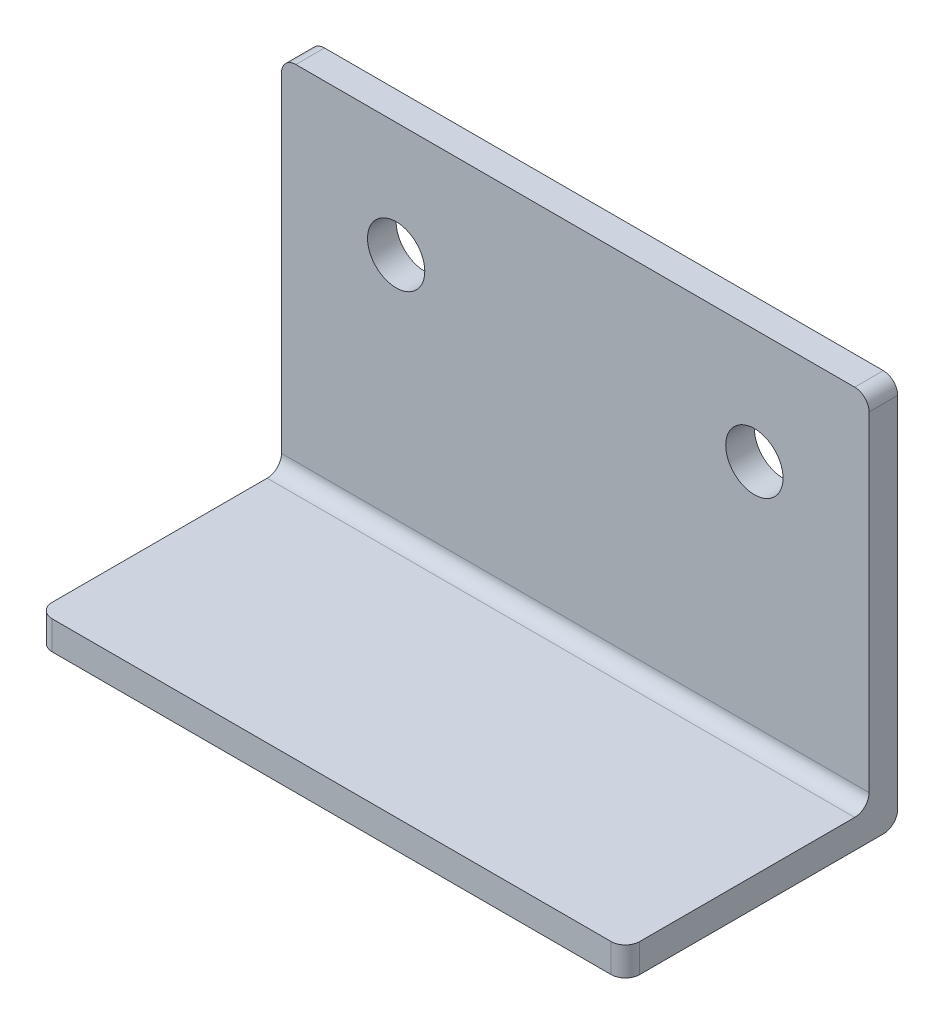
ISO-10303-21;
HEADER;
FILE_DESCRIPTION(('STEP AP214'),'2;1');
FILE_NAME('part.step','',(''),(''),'','','');
FILE_SCHEMA(('AUTOMOTIVE_DESIGN { 1 0 10303 214 1 1 1 1 }'));
ENDSEC;
DATA;
#1=APPLICATION_CONTEXT('core data for automotive mechanical design processes');
#2=APPLICATION_PROTOCOL_DEFINITION('international standard','automotive_design',2000,#1);
#3=PRODUCT_CONTEXT('',#1,'mechanical');
#4=PRODUCT('Part','Part','',(#3));
#5=PRODUCT_RELATED_PRODUCT_CATEGORY('part','',(#4));
#6=PRODUCT_DEFINITION_FORMATION('','',#4);
#7=PRODUCT_DEFINITION_CONTEXT('part definition',#1,'design');
#8=PRODUCT_DEFINITION('design','',#6,#7);
#9=PRODUCT_DEFINITION_SHAPE('','',#8);
#10=(LENGTH_UNIT() NAMED_UNIT(*) SI_UNIT(.MILLI.,.METRE.));
#11=(NAMED_UNIT(*) PLANE_ANGLE_UNIT() SI_UNIT($,.RADIAN.));
#12=(NAMED_UNIT(*) SI_UNIT($,.STERADIAN.) SOLID_ANGLE_UNIT());
#13=UNCERTAINTY_MEASURE_WITH_UNIT(LENGTH_MEASURE(1.E-05),#10,'distance_accuracy_value','');
#14=(GEOMETRIC_REPRESENTATION_CONTEXT(3) GLOBAL_UNCERTAINTY_ASSIGNED_CONTEXT((#13)) GLOBAL_UNIT_ASSIGNED_CONTEXT((#10,
#11,#12)) REPRESENTATION_CONTEXT('',''));
#15=CARTESIAN_POINT('',(0.,0.,0.));
#16=DIRECTION('',(0.,0.,1.));
#17=DIRECTION('',(1.,0.,0.));
#18=AXIS2_PLACEMENT_3D('',#15,#16,#17);
#19=CARTESIAN_POINT('',(20.5,2.,-9.5));
#20=DIRECTION('',(-1.,0.,0.));
#21=DIRECTION('',(0.,0.,1.));
#22=AXIS2_PLACEMENT_3D('',#19,#20,#21);
#23=PLANE('',#22);
#24=DIRECTION('',(0.,-1.,0.));
#25=VECTOR('',#24,1.);
#26=CARTESIAN_POINT('',(20.5,2.,-9.5));
#27=LINE('',#26,#25);
#28=CARTESIAN_POINT('',(20.5,26.,-9.5));
#29=VERTEX_POINT('',#28);
#30=CARTESIAN_POINT('',(20.5,1.,-9.5));
#31=VERTEX_POINT('',#30);
#32=EDGE_CURVE('E146',#29,#31,#27,.T.);
#33=ORIENTED_EDGE('',*,*,#32,.F.);
#34=DIRECTION('',(0.,0.,-1.));
#35=VECTOR('',#34,1.);
#36=CARTESIAN_POINT('',(20.5,26.,-7.5));
#37=LINE('',#36,#35);
#38=CARTESIAN_POINT('',(20.5,26.,-7.5));
#39=VERTEX_POINT('',#38);
#40=EDGE_CURVE('E47',#29,#39,#37,.F.);
#41=ORIENTED_EDGE('',*,*,#40,.T.);
#42=DIRECTION('',(0.,-1.,0.));
#43=VECTOR('',#42,1.);
#44=CARTESIAN_POINT('',(20.5,27.,-7.5));
#45=LINE('',#44,#43);
#46=CARTESIAN_POINT('',(20.5,3.,-7.5));
#47=VERTEX_POINT('',#46);
#48=EDGE_CURVE('E124',#39,#47,#45,.T.);
#49=ORIENTED_EDGE('',*,*,#48,.T.);
#50=CARTESIAN_POINT('',(20.5,3.,-6.5));
#51=DIRECTION('',(-1.,0.,0.));
#52=DIRECTION('',(0.,0.,1.));
#53=AXIS2_PLACEMENT_3D('',#50,#51,#52);
#54=CIRCLE('',#53,1.);
#55=CARTESIAN_POINT('',(20.5,2.,-6.5));
#56=VERTEX_POINT('',#55);
#57=EDGE_CURVE('E127',#47,#56,#54,.T.);
#58=ORIENTED_EDGE('',*,*,#57,.T.);
#59=DIRECTION('',(0.,0.,-1.));
#60=VECTOR('',#59,1.);
#61=CARTESIAN_POINT('',(20.5,2.,-9.5));
#62=LINE('',#61,#60);
#63=CARTESIAN_POINT('',(20.5,2.,8.5));
#64=VERTEX_POINT('',#63);
#65=EDGE_CURVE('E214',#64,#56,#62,.T.);
#66=ORIENTED_EDGE('',*,*,#65,.F.);
#67=DIRECTION('',(0.,-1.,0.));
#68=VECTOR('',#67,1.);
#69=CARTESIAN_POINT('',(20.5,2.,8.5));
#70=LINE('',#69,#68);
#71=CARTESIAN_POINT('',(20.5,0.,8.5));
#72=VERTEX_POINT('',#71);
#73=EDGE_CURVE('E174',#64,#72,#70,.T.);
#74=ORIENTED_EDGE('',*,*,#73,.T.);
#75=DIRECTION('',(0.,0.,-1.));
#76=VECTOR('',#75,1.);
#77=CARTESIAN_POINT('',(20.5,0.,-9.5));
#78=LINE('',#77,#76);
#79=CARTESIAN_POINT('',(20.5,0.,-8.5));
#80=VERTEX_POINT('',#79);
#81=EDGE_CURVE('E213',#72,#80,#78,.T.);
#82=ORIENTED_EDGE('',*,*,#81,.T.);
#83=CARTESIAN_POINT('',(20.5,1.,-8.5));
#84=DIRECTION('',(-1.,0.,0.));
#85=DIRECTION('',(0.,0.,1.));
#86=AXIS2_PLACEMENT_3D('',#83,#84,#85);
#87=CIRCLE('',#86,1.);
#88=EDGE_CURVE('E162',#80,#31,#87,.F.);
#89=ORIENTED_EDGE('',*,*,#88,.T.);
#90=EDGE_LOOP('',(#33,#41,#49,#58,#66,#74,#82,#89));
#91=FACE_BOUND('',#90,.T.);
#92=ADVANCED_FACE('F39',(#91),#23,.F.);
#93=CARTESIAN_POINT('',(-20.5,2.,-9.5));
#94=DIRECTION('',(0.,0.,1.));
#95=DIRECTION('',(1.,0.,0.));
#96=AXIS2_PLACEMENT_3D('',#93,#94,#95);
#97=PLANE('',#96);
#98=CARTESIAN_POINT('',(-12.5,19.,-9.5));
#99=DIRECTION('',(0.,0.,1.));
#100=DIRECTION('',(1.,0.,0.));
#101=AXIS2_PLACEMENT_3D('',#98,#99,#100);
#102=CIRCLE('',#101,2.);
#103=CARTESIAN_POINT('',(-10.5,19.,-9.5));
#104=VERTEX_POINT('',#103);
#105=EDGE_CURVE('E208',#104,#104,#102,.T.);
#106=ORIENTED_EDGE('',*,*,#105,.T.);
#107=EDGE_LOOP('',(#106));
#108=FACE_BOUND('',#107,.T.);
#109=CARTESIAN_POINT('',(12.5,19.,-9.5));
#110=DIRECTION('',(0.,0.,1.));
#111=DIRECTION('',(1.,0.,0.));
#112=AXIS2_PLACEMENT_3D('',#109,#110,#111);
#113=CIRCLE('',#112,2.);
#114=CARTESIAN_POINT('',(14.5,19.,-9.5));
#115=VERTEX_POINT('',#114);
#116=EDGE_CURVE('E374',#115,#115,#113,.T.);
#117=ORIENTED_EDGE('',*,*,#116,.T.);
#118=EDGE_LOOP('',(#117));
#119=FACE_BOUND('',#118,.T.);
#120=DIRECTION('',(-1.,0.,0.));
#121=VECTOR('',#120,1.);
#122=CARTESIAN_POINT('',(-20.5,27.,-9.5));
#123=LINE('',#122,#121);
#124=CARTESIAN_POINT('',(19.5,27.,-9.5));
#125=VERTEX_POINT('',#124);
#126=CARTESIAN_POINT('',(-19.5,27.,-9.5));
#127=VERTEX_POINT('',#126);
#128=EDGE_CURVE('E133',#125,#127,#123,.T.);
#129=ORIENTED_EDGE('',*,*,#128,.F.);
#130=CARTESIAN_POINT('',(19.5,26.,-9.5));
#131=DIRECTION('',(0.,0.,1.));
#132=DIRECTION('',(1.,0.,0.));
#133=AXIS2_PLACEMENT_3D('',#130,#131,#132);
#134=CIRCLE('',#133,1.);
#135=EDGE_CURVE('E61',#125,#29,#134,.F.);
#136=ORIENTED_EDGE('',*,*,#135,.T.);
#137=ORIENTED_EDGE('',*,*,#32,.T.);
#138=DIRECTION('',(-1.,0.,0.));
#139=VECTOR('',#138,1.);
#140=CARTESIAN_POINT('',(-20.5,1.,-9.5));
#141=LINE('',#140,#139);
#142=CARTESIAN_POINT('',(-20.5,1.,-9.5));
#143=VERTEX_POINT('',#142);
#144=EDGE_CURVE('E154',#31,#143,#141,.T.);
#145=ORIENTED_EDGE('',*,*,#144,.T.);
#146=DIRECTION('',(0.,-1.,0.));
#147=VECTOR('',#146,1.);
#148=CARTESIAN_POINT('',(-20.5,2.,-9.5));
#149=LINE('',#148,#147);
#150=CARTESIAN_POINT('',(-20.5,26.,-9.5));
#151=VERTEX_POINT('',#150);
#152=EDGE_CURVE('E149',#151,#143,#149,.T.);
#153=ORIENTED_EDGE('',*,*,#152,.F.);
#154=CARTESIAN_POINT('',(-19.5,26.,-9.5));
#155=DIRECTION('',(0.,0.,1.));
#156=DIRECTION('',(1.,0.,0.));
#157=AXIS2_PLACEMENT_3D('',#154,#155,#156);
#158=CIRCLE('',#157,1.);
#159=EDGE_CURVE('E190',#151,#127,#158,.F.);
#160=ORIENTED_EDGE('',*,*,#159,.T.);
#161=EDGE_LOOP('',(#129,#136,#137,#145,#153,#160));
#162=FACE_BOUND('',#161,.T.);
#163=ADVANCED_FACE('F203',(#108,#119,#162),#97,.F.);
#164=CARTESIAN_POINT('',(-20.5,2.,-9.5));
#165=DIRECTION('',(1.,0.,0.));
#166=DIRECTION('',(0.,0.,-1.));
#167=AXIS2_PLACEMENT_3D('',#164,#165,#166);
#168=PLANE('',#167);
#169=DIRECTION('',(0.,-1.,0.));
#170=VECTOR('',#169,1.);
#171=CARTESIAN_POINT('',(-20.5,27.,-7.5));
#172=LINE('',#171,#170);
#173=CARTESIAN_POINT('',(-20.5,26.,-7.5));
#174=VERTEX_POINT('',#173);
#175=CARTESIAN_POINT('',(-20.5,3.,-7.5));
#176=VERTEX_POINT('',#175);
#177=EDGE_CURVE('E132',#174,#176,#172,.T.);
#178=ORIENTED_EDGE('',*,*,#177,.F.);
#179=DIRECTION('',(0.,0.,1.));
#180=VECTOR('',#179,1.);
#181=CARTESIAN_POINT('',(-20.5,26.,-9.5));
#182=LINE('',#181,#180);
#183=EDGE_CURVE('E188',#174,#151,#182,.F.);
#184=ORIENTED_EDGE('',*,*,#183,.T.);
#185=ORIENTED_EDGE('',*,*,#152,.T.);
#186=CARTESIAN_POINT('',(-20.5,1.,-8.5));
#187=DIRECTION('',(1.,0.,0.));
#188=DIRECTION('',(0.,0.,-1.));
#189=AXIS2_PLACEMENT_3D('',#186,#187,#188);
#190=CIRCLE('',#189,1.);
#191=CARTESIAN_POINT('',(-20.5,0.,-8.5));
#192=VERTEX_POINT('',#191);
#193=EDGE_CURVE('E157',#143,#192,#190,.F.);
#194=ORIENTED_EDGE('',*,*,#193,.T.);
#195=DIRECTION('',(0.,0.,1.));
#196=VECTOR('',#195,1.);
#197=CARTESIAN_POINT('',(-20.5,0.,-9.5));
#198=LINE('',#197,#196);
#199=CARTESIAN_POINT('',(-20.5,0.,8.5));
#200=VERTEX_POINT('',#199);
#201=EDGE_CURVE('E224',#192,#200,#198,.T.);
#202=ORIENTED_EDGE('',*,*,#201,.T.);
#203=DIRECTION('',(0.,-1.,0.));
#204=VECTOR('',#203,1.);
#205=CARTESIAN_POINT('',(-20.5,2.,8.5));
#206=LINE('',#205,#204);
#207=CARTESIAN_POINT('',(-20.5,2.,8.5));
#208=VERTEX_POINT('',#207);
#209=EDGE_CURVE('E170',#200,#208,#206,.F.);
#210=ORIENTED_EDGE('',*,*,#209,.T.);
#211=DIRECTION('',(0.,0.,1.));
#212=VECTOR('',#211,1.);
#213=CARTESIAN_POINT('',(-20.5,2.,-9.5));
#214=LINE('',#213,#212);
#215=CARTESIAN_POINT('',(-20.5,2.,-6.5));
#216=VERTEX_POINT('',#215);
#217=EDGE_CURVE('E216',#216,#208,#214,.T.);
#218=ORIENTED_EDGE('',*,*,#217,.F.);
#219=CARTESIAN_POINT('',(-20.5,3.,-6.5));
#220=DIRECTION('',(1.,0.,0.));
#221=DIRECTION('',(0.,0.,-1.));
#222=AXIS2_PLACEMENT_3D('',#219,#220,#221);
#223=CIRCLE('',#222,1.);
#224=EDGE_CURVE('E141',#216,#176,#223,.T.);
#225=ORIENTED_EDGE('',*,*,#224,.T.);
#226=EDGE_LOOP('',(#178,#184,#185,#194,#202,#210,#218,#225));
#227=FACE_BOUND('',#226,.T.);
#228=ADVANCED_FACE('F230',(#227),#168,.F.);
#229=CARTESIAN_POINT('',(-20.5,2.,9.5));
#230=DIRECTION('',(0.,0.,-1.));
#231=DIRECTION('',(-1.,0.,0.));
#232=AXIS2_PLACEMENT_3D('',#229,#230,#231);
#233=PLANE('',#232);
#234=DIRECTION('',(1.,0.,0.));
#235=VECTOR('',#234,1.);
#236=CARTESIAN_POINT('',(-20.5,0.,9.5));
#237=LINE('',#236,#235);
#238=CARTESIAN_POINT('',(-19.5,0.,9.5));
#239=VERTEX_POINT('',#238);
#240=CARTESIAN_POINT('',(19.5,0.,9.5));
#241=VERTEX_POINT('',#240);
#242=EDGE_CURVE('E217',#239,#241,#237,.T.);
#243=ORIENTED_EDGE('',*,*,#242,.T.);
#244=DIRECTION('',(0.,-1.,0.));
#245=VECTOR('',#244,1.);
#246=CARTESIAN_POINT('',(19.5,2.,9.5));
#247=LINE('',#246,#245);
#248=CARTESIAN_POINT('',(19.5,2.,9.5));
#249=VERTEX_POINT('',#248);
#250=EDGE_CURVE('E179',#241,#249,#247,.F.);
#251=ORIENTED_EDGE('',*,*,#250,.T.);
#252=DIRECTION('',(1.,0.,0.));
#253=VECTOR('',#252,1.);
#254=CARTESIAN_POINT('',(-20.5,2.,9.5));
#255=LINE('',#254,#253);
#256=CARTESIAN_POINT('',(-19.5,2.,9.5));
#257=VERTEX_POINT('',#256);
#258=EDGE_CURVE('E220',#257,#249,#255,.T.);
#259=ORIENTED_EDGE('',*,*,#258,.F.);
#260=DIRECTION('',(0.,-1.,0.));
#261=VECTOR('',#260,1.);
#262=CARTESIAN_POINT('',(-19.5,2.,9.5));
#263=LINE('',#262,#261);
#264=EDGE_CURVE('E165',#257,#239,#263,.T.);
#265=ORIENTED_EDGE('',*,*,#264,.T.);
#266=EDGE_LOOP('',(#243,#251,#259,#265));
#267=FACE_BOUND('',#266,.T.);
#268=ADVANCED_FACE('F254',(#267),#233,.F.);
#269=CARTESIAN_POINT('',(0.,2.,0.));
#270=DIRECTION('',(0.,1.,0.));
#271=DIRECTION('',(0.,0.,1.));
#272=AXIS2_PLACEMENT_3D('',#269,#270,#271);
#273=PLANE('',#272);
#274=ORIENTED_EDGE('',*,*,#258,.T.);
#275=CARTESIAN_POINT('',(19.5,2.,8.5));
#276=DIRECTION('',(0.,1.,0.));
#277=DIRECTION('',(0.,0.,1.));
#278=AXIS2_PLACEMENT_3D('',#275,#276,#277);
#279=CIRCLE('',#278,1.);
#280=EDGE_CURVE('E181',#249,#64,#279,.T.);
#281=ORIENTED_EDGE('',*,*,#280,.T.);
#282=ORIENTED_EDGE('',*,*,#65,.T.);
#283=DIRECTION('',(1.,0.,0.));
#284=VECTOR('',#283,1.);
#285=CARTESIAN_POINT('',(0.,2.,-6.5));
#286=LINE('',#285,#284);
#287=EDGE_CURVE('E140',#56,#216,#286,.F.);
#288=ORIENTED_EDGE('',*,*,#287,.T.);
#289=ORIENTED_EDGE('',*,*,#217,.T.);
#290=CARTESIAN_POINT('',(-19.5,2.,8.5));
#291=DIRECTION('',(0.,1.,0.));
#292=DIRECTION('',(0.,0.,1.));
#293=AXIS2_PLACEMENT_3D('',#290,#291,#292);
#294=CIRCLE('',#293,1.);
#295=EDGE_CURVE('E172',#208,#257,#294,.T.);
#296=ORIENTED_EDGE('',*,*,#295,.T.);
#297=EDGE_LOOP('',(#274,#281,#282,#288,#289,#296));
#298=FACE_BOUND('',#297,.T.);
#299=ADVANCED_FACE('F251',(#298),#273,.T.);
#300=CARTESIAN_POINT('',(0.,0.,0.));
#301=DIRECTION('',(0.,1.,0.));
#302=DIRECTION('',(0.,0.,1.));
#303=AXIS2_PLACEMENT_3D('',#300,#301,#302);
#304=PLANE('',#303);
#305=ORIENTED_EDGE('',*,*,#81,.F.);
#306=CARTESIAN_POINT('',(19.5,0.,8.5));
#307=DIRECTION('',(0.,1.,0.));
#308=DIRECTION('',(0.,0.,1.));
#309=AXIS2_PLACEMENT_3D('',#306,#307,#308);
#310=CIRCLE('',#309,1.);
#311=EDGE_CURVE('E177',#72,#241,#310,.F.);
#312=ORIENTED_EDGE('',*,*,#311,.T.);
#313=ORIENTED_EDGE('',*,*,#242,.F.);
#314=CARTESIAN_POINT('',(-19.5,0.,8.5));
#315=DIRECTION('',(0.,1.,0.));
#316=DIRECTION('',(0.,0.,1.));
#317=AXIS2_PLACEMENT_3D('',#314,#315,#316);
#318=CIRCLE('',#317,1.);
#319=EDGE_CURVE('E168',#239,#200,#318,.F.);
#320=ORIENTED_EDGE('',*,*,#319,.T.);
#321=ORIENTED_EDGE('',*,*,#201,.F.);
#322=DIRECTION('',(-1.,0.,0.));
#323=VECTOR('',#322,1.);
#324=CARTESIAN_POINT('',(0.,0.,-8.5));
#325=LINE('',#324,#323);
#326=EDGE_CURVE('E159',#192,#80,#325,.F.);
#327=ORIENTED_EDGE('',*,*,#326,.T.);
#328=EDGE_LOOP('',(#305,#312,#313,#320,#321,#327));
#329=FACE_BOUND('',#328,.T.);
#330=ADVANCED_FACE('F241',(#329),#304,.F.);
#331=CARTESIAN_POINT('',(-20.5,27.,-7.5));
#332=DIRECTION('',(0.,0.,-1.));
#333=DIRECTION('',(-1.,0.,0.));
#334=AXIS2_PLACEMENT_3D('',#331,#332,#333);
#335=PLANE('',#334);
#336=CARTESIAN_POINT('',(-12.5,19.,-7.5));
#337=DIRECTION('',(0.,0.,1.));
#338=DIRECTION('',(1.,0.,0.));
#339=AXIS2_PLACEMENT_3D('',#336,#337,#338);
#340=CIRCLE('',#339,2.);
#341=CARTESIAN_POINT('',(-10.5,19.,-7.5));
#342=VERTEX_POINT('',#341);
#343=EDGE_CURVE('E371',#342,#342,#340,.T.);
#344=ORIENTED_EDGE('',*,*,#343,.F.);
#345=EDGE_LOOP('',(#344));
#346=FACE_BOUND('',#345,.T.);
#347=CARTESIAN_POINT('',(12.5,19.,-7.5));
#348=DIRECTION('',(0.,0.,1.));
#349=DIRECTION('',(-1.,0.,0.));
#350=AXIS2_PLACEMENT_3D('',#347,#348,#349);
#351=CIRCLE('',#350,2.);
#352=CARTESIAN_POINT('',(10.5,19.,-7.5));
#353=VERTEX_POINT('',#352);
#354=EDGE_CURVE('E378',#353,#353,#351,.T.);
#355=ORIENTED_EDGE('',*,*,#354,.F.);
#356=EDGE_LOOP('',(#355));
#357=FACE_BOUND('',#356,.T.);
#358=ORIENTED_EDGE('',*,*,#48,.F.);
#359=CARTESIAN_POINT('',(19.5,26.,-7.5));
#360=DIRECTION('',(0.,0.,-1.));
#361=DIRECTION('',(-1.,0.,0.));
#362=AXIS2_PLACEMENT_3D('',#359,#360,#361);
#363=CIRCLE('',#362,1.);
#364=CARTESIAN_POINT('',(19.5,27.,-7.5));
#365=VERTEX_POINT('',#364);
#366=EDGE_CURVE('E11',#39,#365,#363,.F.);
#367=ORIENTED_EDGE('',*,*,#366,.T.);
#368=DIRECTION('',(1.,0.,0.));
#369=VECTOR('',#368,1.);
#370=CARTESIAN_POINT('',(-20.5,27.,-7.5));
#371=LINE('',#370,#369);
#372=CARTESIAN_POINT('',(-19.5,27.,-7.5));
#373=VERTEX_POINT('',#372);
#374=EDGE_CURVE('E201',#373,#365,#371,.T.);
#375=ORIENTED_EDGE('',*,*,#374,.F.);
#376=CARTESIAN_POINT('',(-19.5,26.,-7.5));
#377=DIRECTION('',(0.,0.,-1.));
#378=DIRECTION('',(-1.,0.,0.));
#379=AXIS2_PLACEMENT_3D('',#376,#377,#378);
#380=CIRCLE('',#379,1.);
#381=EDGE_CURVE('E186',#373,#174,#380,.F.);
#382=ORIENTED_EDGE('',*,*,#381,.T.);
#383=ORIENTED_EDGE('',*,*,#177,.T.);
#384=DIRECTION('',(1.,0.,0.));
#385=VECTOR('',#384,1.);
#386=CARTESIAN_POINT('',(-20.5,3.,-7.5));
#387=LINE('',#386,#385);
#388=EDGE_CURVE('E139',#176,#47,#387,.T.);
#389=ORIENTED_EDGE('',*,*,#388,.T.);
#390=EDGE_LOOP('',(#358,#367,#375,#382,#383,#389));
#391=FACE_BOUND('',#390,.T.);
#392=ADVANCED_FACE('F143',(#346,#357,#391),#335,.F.);
#393=CARTESIAN_POINT('',(0.,27.,0.));
#394=DIRECTION('',(0.,1.,0.));
#395=DIRECTION('',(0.,0.,1.));
#396=AXIS2_PLACEMENT_3D('',#393,#394,#395);
#397=PLANE('',#396);
#398=ORIENTED_EDGE('',*,*,#374,.T.);
#399=DIRECTION('',(0.,0.,-1.));
#400=VECTOR('',#399,1.);
#401=CARTESIAN_POINT('',(19.5,27.,-9.5));
#402=LINE('',#401,#400);
#403=EDGE_CURVE('E193',#365,#125,#402,.T.);
#404=ORIENTED_EDGE('',*,*,#403,.T.);
#405=ORIENTED_EDGE('',*,*,#128,.T.);
#406=DIRECTION('',(0.,0.,1.));
#407=VECTOR('',#406,1.);
#408=CARTESIAN_POINT('',(-19.5,27.,-7.5));
#409=LINE('',#408,#407);
#410=EDGE_CURVE('E183',#127,#373,#409,.T.);
#411=ORIENTED_EDGE('',*,*,#410,.T.);
#412=EDGE_LOOP('',(#398,#404,#405,#411));
#413=FACE_BOUND('',#412,.T.);
#414=ADVANCED_FACE('F199',(#413),#397,.T.);
#415=CARTESIAN_POINT('',(12.5,19.,-32.5));
#416=DIRECTION('',(0.,0.,1.));
#417=DIRECTION('',(1.,0.,0.));
#418=AXIS2_PLACEMENT_3D('',#415,#416,#417);
#419=CYLINDRICAL_SURFACE('',#418,2.);
#420=ORIENTED_EDGE('',*,*,#354,.T.);
#421=EDGE_LOOP('',(#420));
#422=FACE_BOUND('',#421,.T.);
#423=ORIENTED_EDGE('',*,*,#116,.F.);
#424=EDGE_LOOP('',(#423));
#425=FACE_BOUND('',#424,.T.);
#426=ADVANCED_FACE('F321',(#422,#425),#419,.F.);
#427=CARTESIAN_POINT('',(-12.5,19.,-32.5));
#428=DIRECTION('',(0.,0.,1.));
#429=DIRECTION('',(1.,0.,0.));
#430=AXIS2_PLACEMENT_3D('',#427,#428,#429);
#431=CYLINDRICAL_SURFACE('',#430,2.);
#432=ORIENTED_EDGE('',*,*,#343,.T.);
#433=EDGE_LOOP('',(#432));
#434=FACE_BOUND('',#433,.T.);
#435=ORIENTED_EDGE('',*,*,#105,.F.);
#436=EDGE_LOOP('',(#435));
#437=FACE_BOUND('',#436,.T.);
#438=ADVANCED_FACE('F276',(#434,#437),#431,.F.);
#439=CARTESIAN_POINT('',(-20.5,3.,-6.5));
#440=DIRECTION('',(1.,0.,0.));
#441=DIRECTION('',(0.,0.,-1.));
#442=AXIS2_PLACEMENT_3D('',#439,#440,#441);
#443=CYLINDRICAL_SURFACE('',#442,1.);
#444=ORIENTED_EDGE('',*,*,#224,.F.);
#445=ORIENTED_EDGE('',*,*,#287,.F.);
#446=ORIENTED_EDGE('',*,*,#57,.F.);
#447=ORIENTED_EDGE('',*,*,#388,.F.);
#448=EDGE_LOOP('',(#444,#445,#446,#447));
#449=FACE_BOUND('',#448,.T.);
#450=ADVANCED_FACE('F138',(#449),#443,.F.);
#451=CARTESIAN_POINT('',(-20.5,1.,-8.5));
#452=DIRECTION('',(-1.,0.,0.));
#453=DIRECTION('',(0.,0.,1.));
#454=AXIS2_PLACEMENT_3D('',#451,#452,#453);
#455=CYLINDRICAL_SURFACE('',#454,1.);
#456=ORIENTED_EDGE('',*,*,#88,.F.);
#457=ORIENTED_EDGE('',*,*,#326,.F.);
#458=ORIENTED_EDGE('',*,*,#193,.F.);
#459=ORIENTED_EDGE('',*,*,#144,.F.);
#460=EDGE_LOOP('',(#456,#457,#458,#459));
#461=FACE_BOUND('',#460,.T.);
#462=ADVANCED_FACE('F237',(#461),#455,.T.);
#463=CARTESIAN_POINT('',(-19.5,2.,8.5));
#464=DIRECTION('',(0.,-1.,0.));
#465=DIRECTION('',(0.,0.,-1.));
#466=AXIS2_PLACEMENT_3D('',#463,#464,#465);
#467=CYLINDRICAL_SURFACE('',#466,1.);
#468=ORIENTED_EDGE('',*,*,#295,.F.);
#469=ORIENTED_EDGE('',*,*,#209,.F.);
#470=ORIENTED_EDGE('',*,*,#319,.F.);
#471=ORIENTED_EDGE('',*,*,#264,.F.);
#472=EDGE_LOOP('',(#468,#469,#470,#471));
#473=FACE_BOUND('',#472,.T.);
#474=ADVANCED_FACE('F247',(#473),#467,.T.);
#475=CARTESIAN_POINT('',(19.5,2.,8.5));
#476=DIRECTION('',(0.,-1.,0.));
#477=DIRECTION('',(0.,0.,-1.));
#478=AXIS2_PLACEMENT_3D('',#475,#476,#477);
#479=CYLINDRICAL_SURFACE('',#478,1.);
#480=ORIENTED_EDGE('',*,*,#280,.F.);
#481=ORIENTED_EDGE('',*,*,#250,.F.);
#482=ORIENTED_EDGE('',*,*,#311,.F.);
#483=ORIENTED_EDGE('',*,*,#73,.F.);
#484=EDGE_LOOP('',(#480,#481,#482,#483));
#485=FACE_BOUND('',#484,.T.);
#486=ADVANCED_FACE('F257',(#485),#479,.T.);
#487=CARTESIAN_POINT('',(-19.5,26.,0.));
#488=DIRECTION('',(0.,0.,-1.));
#489=DIRECTION('',(-1.,0.,0.));
#490=AXIS2_PLACEMENT_3D('',#487,#488,#489);
#491=CYLINDRICAL_SURFACE('',#490,1.);
#492=ORIENTED_EDGE('',*,*,#159,.F.);
#493=ORIENTED_EDGE('',*,*,#183,.F.);
#494=ORIENTED_EDGE('',*,*,#381,.F.);
#495=ORIENTED_EDGE('',*,*,#410,.F.);
#496=EDGE_LOOP('',(#492,#493,#494,#495));
#497=FACE_BOUND('',#496,.T.);
#498=ADVANCED_FACE('F259',(#497),#491,.T.);
#499=CARTESIAN_POINT('',(19.5,26.,0.));
#500=DIRECTION('',(0.,0.,1.));
#501=DIRECTION('',(1.,0.,0.));
#502=AXIS2_PLACEMENT_3D('',#499,#500,#501);
#503=CYLINDRICAL_SURFACE('',#502,1.);
#504=ORIENTED_EDGE('',*,*,#366,.F.);
#505=ORIENTED_EDGE('',*,*,#40,.F.);
#506=ORIENTED_EDGE('',*,*,#135,.F.);
#507=ORIENTED_EDGE('',*,*,#403,.F.);
#508=EDGE_LOOP('',(#504,#505,#506,#507));
#509=FACE_BOUND('',#508,.T.);
#510=ADVANCED_FACE('F41',(#509),#503,.T.);
#511=CLOSED_SHELL('',(#92,#163,#228,#268,#299,#330,#392,#414,#426,#438,#450,#462,#474,#486,#498,#510));
#512=MANIFOLD_SOLID_BREP('B2',#511);
#513=ADVANCED_BREP_SHAPE_REPRESENTATION('',(#18,#512),#14);
#514=SHAPE_DEFINITION_REPRESENTATION(#9,#513);
ENDSEC;
END-ISO-10303-21;
